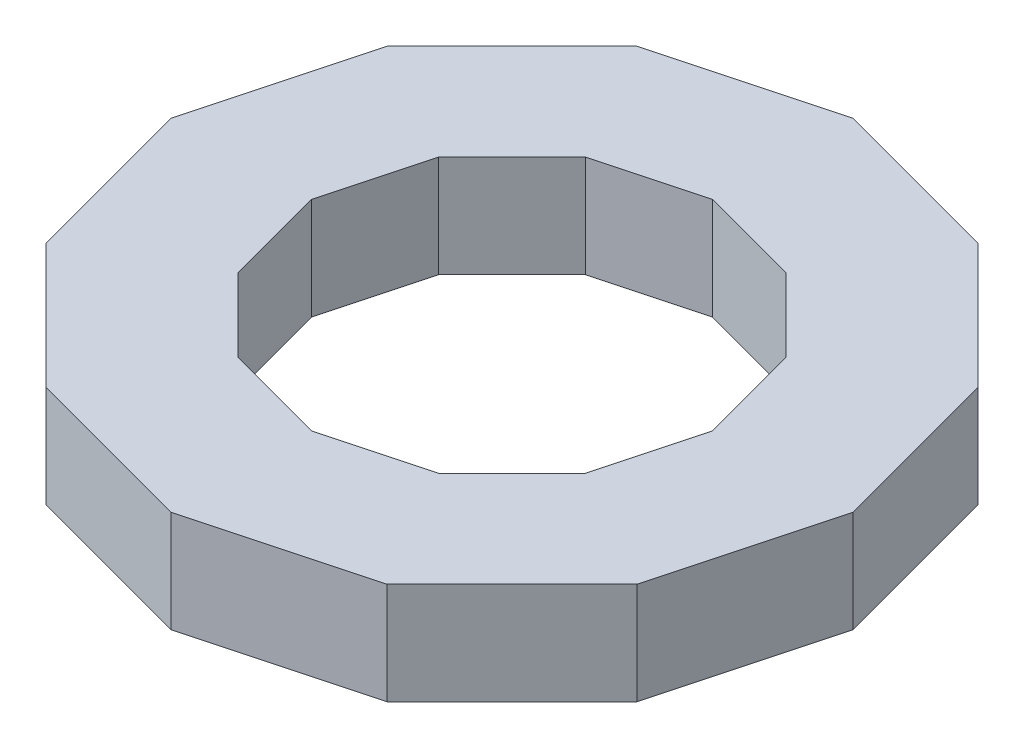
ISO-10303-21;
HEADER;
FILE_DESCRIPTION(('STEP AP214'),'2;1');
FILE_NAME('part.step','',(''),(''),'','','');
FILE_SCHEMA(('AUTOMOTIVE_DESIGN { 1 0 10303 214 1 1 1 1 }'));
ENDSEC;
DATA;
#1=APPLICATION_CONTEXT('core data for automotive mechanical design processes');
#2=APPLICATION_PROTOCOL_DEFINITION('international standard','automotive_design',2000,#1);
#3=PRODUCT_CONTEXT('',#1,'mechanical');
#4=PRODUCT('Part','Part','',(#3));
#5=PRODUCT_RELATED_PRODUCT_CATEGORY('part','',(#4));
#6=PRODUCT_DEFINITION_FORMATION('','',#4);
#7=PRODUCT_DEFINITION_CONTEXT('part definition',#1,'design');
#8=PRODUCT_DEFINITION('design','',#6,#7);
#9=PRODUCT_DEFINITION_SHAPE('','',#8);
#10=(LENGTH_UNIT() NAMED_UNIT(*) SI_UNIT(.MILLI.,.METRE.));
#11=(NAMED_UNIT(*) PLANE_ANGLE_UNIT() SI_UNIT($,.RADIAN.));
#12=(NAMED_UNIT(*) SI_UNIT($,.STERADIAN.) SOLID_ANGLE_UNIT());
#13=UNCERTAINTY_MEASURE_WITH_UNIT(LENGTH_MEASURE(1.E-05),#10,'distance_accuracy_value','');
#14=(GEOMETRIC_REPRESENTATION_CONTEXT(3) GLOBAL_UNCERTAINTY_ASSIGNED_CONTEXT((#13)) GLOBAL_UNIT_ASSIGNED_CONTEXT((#10,
#11,#12)) REPRESENTATION_CONTEXT('',''));
#15=CARTESIAN_POINT('',(0.,0.,0.));
#16=DIRECTION('',(0.,0.,1.));
#17=DIRECTION('',(1.,0.,0.));
#18=AXIS2_PLACEMENT_3D('',#15,#16,#17);
#19=CARTESIAN_POINT('',(0.,19.05,0.));
#20=DIRECTION('',(0.,1.,0.));
#21=DIRECTION('',(0.,0.,1.));
#22=AXIS2_PLACEMENT_3D('',#19,#20,#21);
#23=PLANE('',#22);
#24=DIRECTION('',(0.258819045102522,0.,-0.965925826289068));
#25=VECTOR('',#24,1.);
#26=CARTESIAN_POINT('',(55.2435366988449,19.05,31.8948707840652));
#27=LINE('',#26,#25);
#28=CARTESIAN_POINT('',(55.2435366988449,19.05,31.8948707840652));
#29=VERTEX_POINT('',#28);
#30=CARTESIAN_POINT('',(63.7897415681302,19.05,0.));
#31=VERTEX_POINT('',#30);
#32=EDGE_CURVE('E315',#29,#31,#27,.T.);
#33=ORIENTED_EDGE('',*,*,#32,.T.);
#34=DIRECTION('',(-0.25881904510252,0.,-0.965925826289069));
#35=VECTOR('',#34,1.);
#36=CARTESIAN_POINT('',(63.7897415681302,19.05,0.));
#37=LINE('',#36,#35);
#38=CARTESIAN_POINT('',(55.243536698845,19.05,-31.894870784065));
#39=VERTEX_POINT('',#38);
#40=EDGE_CURVE('E319',#31,#39,#37,.T.);
#41=ORIENTED_EDGE('',*,*,#40,.T.);
#42=DIRECTION('',(-0.707106781186547,0.,-0.707106781186548));
#43=VECTOR('',#42,1.);
#44=CARTESIAN_POINT('',(55.243536698845,19.05,-31.894870784065));
#45=LINE('',#44,#43);
#46=CARTESIAN_POINT('',(31.8948707840651,19.05,-55.243536698845));
#47=VERTEX_POINT('',#46);
#48=EDGE_CURVE('E323',#39,#47,#45,.T.);
#49=ORIENTED_EDGE('',*,*,#48,.T.);
#50=DIRECTION('',(-0.965925826289068,0.,-0.258819045102522));
#51=VECTOR('',#50,1.);
#52=CARTESIAN_POINT('',(31.8948707840651,19.05,-55.243536698845));
#53=LINE('',#52,#51);
#54=CARTESIAN_POINT('',(0.,19.05,-63.7897415681302));
#55=VERTEX_POINT('',#54);
#56=EDGE_CURVE('E325',#47,#55,#53,.T.);
#57=ORIENTED_EDGE('',*,*,#56,.T.);
#58=DIRECTION('',(-0.965925826289069,0.,0.258819045102519));
#59=VECTOR('',#58,1.);
#60=CARTESIAN_POINT('',(0.,19.05,-63.7897415681302));
#61=LINE('',#60,#59);
#62=CARTESIAN_POINT('',(-31.8948707840649,19.05,-55.2435366988451));
#63=VERTEX_POINT('',#62);
#64=EDGE_CURVE('E327',#55,#63,#61,.T.);
#65=ORIENTED_EDGE('',*,*,#64,.T.);
#66=DIRECTION('',(-0.707106781186548,0.,0.707106781186547));
#67=VECTOR('',#66,1.);
#68=CARTESIAN_POINT('',(-31.8948707840649,19.05,-55.2435366988451));
#69=LINE('',#68,#67);
#70=CARTESIAN_POINT('',(-55.2435366988449,19.05,-31.8948707840651));
#71=VERTEX_POINT('',#70);
#72=EDGE_CURVE('E329',#63,#71,#69,.T.);
#73=ORIENTED_EDGE('',*,*,#72,.T.);
#74=DIRECTION('',(-0.258819045102522,0.,0.965925826289068));
#75=VECTOR('',#74,1.);
#76=CARTESIAN_POINT('',(-55.2435366988449,19.05,-31.8948707840651));
#77=LINE('',#76,#75);
#78=CARTESIAN_POINT('',(-63.7897415681302,19.05,0.));
#79=VERTEX_POINT('',#78);
#80=EDGE_CURVE('E331',#71,#79,#77,.T.);
#81=ORIENTED_EDGE('',*,*,#80,.T.);
#82=DIRECTION('',(0.258819045102519,0.,0.965925826289069));
#83=VECTOR('',#82,1.);
#84=CARTESIAN_POINT('',(-63.7897415681302,19.05,0.));
#85=LINE('',#84,#83);
#86=CARTESIAN_POINT('',(-55.2435366988451,19.05,31.894870784065));
#87=VERTEX_POINT('',#86);
#88=EDGE_CURVE('E333',#79,#87,#85,.T.);
#89=ORIENTED_EDGE('',*,*,#88,.T.);
#90=DIRECTION('',(0.707106781186547,0.,0.707106781186548));
#91=VECTOR('',#90,1.);
#92=CARTESIAN_POINT('',(-55.2435366988451,19.05,31.894870784065));
#93=LINE('',#92,#91);
#94=CARTESIAN_POINT('',(-31.8948707840652,19.05,55.2435366988449));
#95=VERTEX_POINT('',#94);
#96=EDGE_CURVE('E336',#87,#95,#93,.T.);
#97=ORIENTED_EDGE('',*,*,#96,.T.);
#98=DIRECTION('',(0.965925826289068,0.,0.258819045102522));
#99=VECTOR('',#98,1.);
#100=CARTESIAN_POINT('',(-31.8948707840652,19.05,55.2435366988449));
#101=LINE('',#100,#99);
#102=CARTESIAN_POINT('',(-1.16998514761717E-13,19.05,63.7897415681302));
#103=VERTEX_POINT('',#102);
#104=EDGE_CURVE('E339',#95,#103,#101,.T.);
#105=ORIENTED_EDGE('',*,*,#104,.T.);
#106=DIRECTION('',(0.965925826289069,0.,-0.258819045102519));
#107=VECTOR('',#106,1.);
#108=CARTESIAN_POINT('',(-1.16998514761717E-13,19.05,63.7897415681302));
#109=LINE('',#108,#107);
#110=CARTESIAN_POINT('',(31.894870784065,19.05,55.243536698845));
#111=VERTEX_POINT('',#110);
#112=EDGE_CURVE('E342',#103,#111,#109,.T.);
#113=ORIENTED_EDGE('',*,*,#112,.T.);
#114=DIRECTION('',(0.707106781186548,0.,-0.707106781186547));
#115=VECTOR('',#114,1.);
#116=CARTESIAN_POINT('',(31.894870784065,19.05,55.243536698845));
#117=LINE('',#116,#115);
#118=EDGE_CURVE('E345',#111,#29,#117,.T.);
#119=ORIENTED_EDGE('',*,*,#118,.T.);
#120=EDGE_LOOP('',(#33,#41,#49,#57,#65,#73,#81,#89,#97,#105,#113,#119));
#121=FACE_BOUND('',#120,.T.);
#122=DIRECTION('',(-0.258819045102519,0.,-0.965925826289069));
#123=VECTOR('',#122,1.);
#124=CARTESIAN_POINT('',(37.4937265857141,19.05,0.));
#125=LINE('',#124,#123);
#126=CARTESIAN_POINT('',(37.4937265857141,19.05,0.));
#127=VERTEX_POINT('',#126);
#128=CARTESIAN_POINT('',(32.4705197057764,19.05,-18.746863292857));
#129=VERTEX_POINT('',#128);
#130=EDGE_CURVE('E205',#127,#129,#125,.T.);
#131=ORIENTED_EDGE('',*,*,#130,.F.);
#132=DIRECTION('',(0.258819045102522,0.,-0.965925826289068));
#133=VECTOR('',#132,1.);
#134=CARTESIAN_POINT('',(32.4705197057763,19.05,18.7468632928571));
#135=LINE('',#134,#133);
#136=CARTESIAN_POINT('',(32.4705197057763,19.05,18.7468632928571));
#137=VERTEX_POINT('',#136);
#138=EDGE_CURVE('E196',#137,#127,#135,.T.);
#139=ORIENTED_EDGE('',*,*,#138,.F.);
#140=DIRECTION('',(0.707106781186548,0.,-0.707106781186547));
#141=VECTOR('',#140,1.);
#142=CARTESIAN_POINT('',(18.746863292857,19.05,32.4705197057764));
#143=LINE('',#142,#141);
#144=CARTESIAN_POINT('',(18.746863292857,19.05,32.4705197057764));
#145=VERTEX_POINT('',#144);
#146=EDGE_CURVE('E248',#145,#137,#143,.T.);
#147=ORIENTED_EDGE('',*,*,#146,.F.);
#148=DIRECTION('',(0.965925826289069,0.,-0.25881904510252));
#149=VECTOR('',#148,1.);
#150=CARTESIAN_POINT('',(0.,19.05,37.4937265857141));
#151=LINE('',#150,#149);
#152=CARTESIAN_POINT('',(0.,19.05,37.4937265857141));
#153=VERTEX_POINT('',#152);
#154=EDGE_CURVE('E245',#153,#145,#151,.T.);
#155=ORIENTED_EDGE('',*,*,#154,.F.);
#156=DIRECTION('',(0.965925826289068,0.,0.258819045102522));
#157=VECTOR('',#156,1.);
#158=CARTESIAN_POINT('',(-18.7468632928571,19.05,32.4705197057764));
#159=LINE('',#158,#157);
#160=CARTESIAN_POINT('',(-18.7468632928571,19.05,32.4705197057764));
#161=VERTEX_POINT('',#160);
#162=EDGE_CURVE('E242',#161,#153,#159,.T.);
#163=ORIENTED_EDGE('',*,*,#162,.F.);
#164=DIRECTION('',(0.707106781186547,0.,0.707106781186548));
#165=VECTOR('',#164,1.);
#166=CARTESIAN_POINT('',(-32.4705197057764,19.05,18.746863292857));
#167=LINE('',#166,#165);
#168=CARTESIAN_POINT('',(-32.4705197057764,19.05,18.746863292857));
#169=VERTEX_POINT('',#168);
#170=EDGE_CURVE('E240',#169,#161,#167,.T.);
#171=ORIENTED_EDGE('',*,*,#170,.F.);
#172=DIRECTION('',(0.258819045102519,0.,0.965925826289069));
#173=VECTOR('',#172,1.);
#174=CARTESIAN_POINT('',(-37.4937265857141,19.05,0.));
#175=LINE('',#174,#173);
#176=CARTESIAN_POINT('',(-37.4937265857141,19.05,0.));
#177=VERTEX_POINT('',#176);
#178=EDGE_CURVE('E238',#177,#169,#175,.T.);
#179=ORIENTED_EDGE('',*,*,#178,.F.);
#180=DIRECTION('',(-0.258819045102522,0.,0.965925826289068));
#181=VECTOR('',#180,1.);
#182=CARTESIAN_POINT('',(-32.4705197057764,19.05,-18.7468632928571));
#183=LINE('',#182,#181);
#184=CARTESIAN_POINT('',(-32.4705197057764,19.05,-18.7468632928571));
#185=VERTEX_POINT('',#184);
#186=EDGE_CURVE('E235',#185,#177,#183,.T.);
#187=ORIENTED_EDGE('',*,*,#186,.F.);
#188=DIRECTION('',(-0.707106781186548,0.,0.707106781186547));
#189=VECTOR('',#188,1.);
#190=CARTESIAN_POINT('',(-18.746863292857,19.05,-32.4705197057765));
#191=LINE('',#190,#189);
#192=CARTESIAN_POINT('',(-18.746863292857,19.05,-32.4705197057765));
#193=VERTEX_POINT('',#192);
#194=EDGE_CURVE('E232',#193,#185,#191,.T.);
#195=ORIENTED_EDGE('',*,*,#194,.F.);
#196=DIRECTION('',(-0.965925826289069,0.,0.258819045102519));
#197=VECTOR('',#196,1.);
#198=CARTESIAN_POINT('',(0.,19.05,-37.4937265857141));
#199=LINE('',#198,#197);
#200=CARTESIAN_POINT('',(0.,19.05,-37.4937265857141));
#201=VERTEX_POINT('',#200);
#202=EDGE_CURVE('E229',#201,#193,#199,.T.);
#203=ORIENTED_EDGE('',*,*,#202,.F.);
#204=DIRECTION('',(-0.965925826289068,0.,-0.258819045102522));
#205=VECTOR('',#204,1.);
#206=CARTESIAN_POINT('',(18.746863292857,19.05,-32.4705197057764));
#207=LINE('',#206,#205);
#208=CARTESIAN_POINT('',(18.746863292857,19.05,-32.4705197057764));
#209=VERTEX_POINT('',#208);
#210=EDGE_CURVE('E224',#209,#201,#207,.T.);
#211=ORIENTED_EDGE('',*,*,#210,.F.);
#212=DIRECTION('',(-0.707106781186547,0.,-0.707106781186548));
#213=VECTOR('',#212,1.);
#214=CARTESIAN_POINT('',(32.4705197057764,19.05,-18.746863292857));
#215=LINE('',#214,#213);
#216=EDGE_CURVE('E218',#129,#209,#215,.T.);
#217=ORIENTED_EDGE('',*,*,#216,.F.);
#218=EDGE_LOOP('',(#131,#139,#147,#155,#163,#171,#179,#187,#195,#203,#211,#217));
#219=FACE_BOUND('',#218,.T.);
#220=ADVANCED_FACE('F35',(#121,#219),#23,.T.);
#221=CARTESIAN_POINT('',(0.,0.,0.));
#222=DIRECTION('',(0.,1.,0.));
#223=DIRECTION('',(0.,0.,1.));
#224=AXIS2_PLACEMENT_3D('',#221,#222,#223);
#225=PLANE('',#224);
#226=DIRECTION('',(0.258819045102522,0.,-0.965925826289068));
#227=VECTOR('',#226,1.);
#228=CARTESIAN_POINT('',(55.2435366988449,0.,31.8948707840652));
#229=LINE('',#228,#227);
#230=CARTESIAN_POINT('',(55.2435366988449,0.,31.8948707840652));
#231=VERTEX_POINT('',#230);
#232=CARTESIAN_POINT('',(63.7897415681302,0.,0.));
#233=VERTEX_POINT('',#232);
#234=EDGE_CURVE('E213',#231,#233,#229,.T.);
#235=ORIENTED_EDGE('',*,*,#234,.F.);
#236=DIRECTION('',(0.707106781186548,0.,-0.707106781186547));
#237=VECTOR('',#236,1.);
#238=CARTESIAN_POINT('',(31.894870784065,0.,55.243536698845));
#239=LINE('',#238,#237);
#240=CARTESIAN_POINT('',(31.894870784065,0.,55.243536698845));
#241=VERTEX_POINT('',#240);
#242=EDGE_CURVE('E320',#241,#231,#239,.T.);
#243=ORIENTED_EDGE('',*,*,#242,.F.);
#244=DIRECTION('',(0.965925826289069,0.,-0.258819045102519));
#245=VECTOR('',#244,1.);
#246=CARTESIAN_POINT('',(-1.16998514761717E-13,0.,63.7897415681302));
#247=LINE('',#246,#245);
#248=CARTESIAN_POINT('',(-1.16998514761717E-13,0.,63.7897415681302));
#249=VERTEX_POINT('',#248);
#250=EDGE_CURVE('E375',#249,#241,#247,.T.);
#251=ORIENTED_EDGE('',*,*,#250,.F.);
#252=DIRECTION('',(0.965925826289068,0.,0.258819045102522));
#253=VECTOR('',#252,1.);
#254=CARTESIAN_POINT('',(-31.8948707840652,0.,55.2435366988449));
#255=LINE('',#254,#253);
#256=CARTESIAN_POINT('',(-31.8948707840652,0.,55.2435366988449));
#257=VERTEX_POINT('',#256);
#258=EDGE_CURVE('E372',#257,#249,#255,.T.);
#259=ORIENTED_EDGE('',*,*,#258,.F.);
#260=DIRECTION('',(0.707106781186547,0.,0.707106781186548));
#261=VECTOR('',#260,1.);
#262=CARTESIAN_POINT('',(-55.2435366988451,0.,31.894870784065));
#263=LINE('',#262,#261);
#264=CARTESIAN_POINT('',(-55.2435366988451,0.,31.894870784065));
#265=VERTEX_POINT('',#264);
#266=EDGE_CURVE('E369',#265,#257,#263,.T.);
#267=ORIENTED_EDGE('',*,*,#266,.F.);
#268=DIRECTION('',(0.258819045102519,0.,0.965925826289069));
#269=VECTOR('',#268,1.);
#270=CARTESIAN_POINT('',(-63.7897415681302,0.,0.));
#271=LINE('',#270,#269);
#272=CARTESIAN_POINT('',(-63.7897415681302,0.,0.));
#273=VERTEX_POINT('',#272);
#274=EDGE_CURVE('E366',#273,#265,#271,.T.);
#275=ORIENTED_EDGE('',*,*,#274,.F.);
#276=DIRECTION('',(-0.258819045102522,0.,0.965925826289068));
#277=VECTOR('',#276,1.);
#278=CARTESIAN_POINT('',(-55.2435366988449,0.,-31.8948707840651));
#279=LINE('',#278,#277);
#280=CARTESIAN_POINT('',(-55.2435366988449,0.,-31.8948707840651));
#281=VERTEX_POINT('',#280);
#282=EDGE_CURVE('E363',#281,#273,#279,.T.);
#283=ORIENTED_EDGE('',*,*,#282,.F.);
#284=DIRECTION('',(-0.707106781186548,0.,0.707106781186547));
#285=VECTOR('',#284,1.);
#286=CARTESIAN_POINT('',(-31.8948707840649,0.,-55.2435366988451));
#287=LINE('',#286,#285);
#288=CARTESIAN_POINT('',(-31.8948707840649,0.,-55.2435366988451));
#289=VERTEX_POINT('',#288);
#290=EDGE_CURVE('E361',#289,#281,#287,.T.);
#291=ORIENTED_EDGE('',*,*,#290,.F.);
#292=DIRECTION('',(-0.965925826289069,0.,0.258819045102519));
#293=VECTOR('',#292,1.);
#294=CARTESIAN_POINT('',(0.,0.,-63.7897415681302));
#295=LINE('',#294,#293);
#296=CARTESIAN_POINT('',(0.,0.,-63.7897415681302));
#297=VERTEX_POINT('',#296);
#298=EDGE_CURVE('E358',#297,#289,#295,.T.);
#299=ORIENTED_EDGE('',*,*,#298,.F.);
#300=DIRECTION('',(-0.965925826289068,0.,-0.258819045102522));
#301=VECTOR('',#300,1.);
#302=CARTESIAN_POINT('',(31.8948707840651,0.,-55.243536698845));
#303=LINE('',#302,#301);
#304=CARTESIAN_POINT('',(31.8948707840651,0.,-55.243536698845));
#305=VERTEX_POINT('',#304);
#306=EDGE_CURVE('E356',#305,#297,#303,.T.);
#307=ORIENTED_EDGE('',*,*,#306,.F.);
#308=DIRECTION('',(-0.707106781186547,0.,-0.707106781186548));
#309=VECTOR('',#308,1.);
#310=CARTESIAN_POINT('',(55.243536698845,0.,-31.894870784065));
#311=LINE('',#310,#309);
#312=CARTESIAN_POINT('',(55.243536698845,0.,-31.894870784065));
#313=VERTEX_POINT('',#312);
#314=EDGE_CURVE('E353',#313,#305,#311,.T.);
#315=ORIENTED_EDGE('',*,*,#314,.F.);
#316=DIRECTION('',(-0.25881904510252,0.,-0.965925826289069));
#317=VECTOR('',#316,1.);
#318=CARTESIAN_POINT('',(63.7897415681302,0.,0.));
#319=LINE('',#318,#317);
#320=EDGE_CURVE('E351',#233,#313,#319,.T.);
#321=ORIENTED_EDGE('',*,*,#320,.F.);
#322=EDGE_LOOP('',(#235,#243,#251,#259,#267,#275,#283,#291,#299,#307,#315,#321));
#323=FACE_BOUND('',#322,.T.);
#324=DIRECTION('',(0.258819045102522,0.,-0.965925826289068));
#325=VECTOR('',#324,1.);
#326=CARTESIAN_POINT('',(32.4705197057763,0.,18.7468632928571));
#327=LINE('',#326,#325);
#328=CARTESIAN_POINT('',(32.4705197057763,0.,18.7468632928571));
#329=VERTEX_POINT('',#328);
#330=CARTESIAN_POINT('',(37.4937265857141,0.,0.));
#331=VERTEX_POINT('',#330);
#332=EDGE_CURVE('E58',#329,#331,#327,.T.);
#333=ORIENTED_EDGE('',*,*,#332,.T.);
#334=DIRECTION('',(-0.258819045102519,0.,-0.965925826289069));
#335=VECTOR('',#334,1.);
#336=CARTESIAN_POINT('',(37.4937265857141,0.,0.));
#337=LINE('',#336,#335);
#338=CARTESIAN_POINT('',(32.4705197057764,0.,-18.746863292857));
#339=VERTEX_POINT('',#338);
#340=EDGE_CURVE('E212',#331,#339,#337,.T.);
#341=ORIENTED_EDGE('',*,*,#340,.T.);
#342=DIRECTION('',(-0.707106781186547,0.,-0.707106781186548));
#343=VECTOR('',#342,1.);
#344=CARTESIAN_POINT('',(32.4705197057764,0.,-18.746863292857));
#345=LINE('',#344,#343);
#346=CARTESIAN_POINT('',(18.746863292857,0.,-32.4705197057764));
#347=VERTEX_POINT('',#346);
#348=EDGE_CURVE('E254',#339,#347,#345,.T.);
#349=ORIENTED_EDGE('',*,*,#348,.T.);
#350=DIRECTION('',(-0.965925826289068,0.,-0.258819045102522));
#351=VECTOR('',#350,1.);
#352=CARTESIAN_POINT('',(18.746863292857,0.,-32.4705197057764));
#353=LINE('',#352,#351);
#354=CARTESIAN_POINT('',(0.,0.,-37.4937265857141));
#355=VERTEX_POINT('',#354);
#356=EDGE_CURVE('E258',#347,#355,#353,.T.);
#357=ORIENTED_EDGE('',*,*,#356,.T.);
#358=DIRECTION('',(-0.965925826289069,0.,0.258819045102519));
#359=VECTOR('',#358,1.);
#360=CARTESIAN_POINT('',(0.,0.,-37.4937265857141));
#361=LINE('',#360,#359);
#362=CARTESIAN_POINT('',(-18.746863292857,0.,-32.4705197057765));
#363=VERTEX_POINT('',#362);
#364=EDGE_CURVE('E262',#355,#363,#361,.T.);
#365=ORIENTED_EDGE('',*,*,#364,.T.);
#366=DIRECTION('',(-0.707106781186548,0.,0.707106781186547));
#367=VECTOR('',#366,1.);
#368=CARTESIAN_POINT('',(-18.746863292857,0.,-32.4705197057765));
#369=LINE('',#368,#367);
#370=CARTESIAN_POINT('',(-32.4705197057764,0.,-18.7468632928571));
#371=VERTEX_POINT('',#370);
#372=EDGE_CURVE('E266',#363,#371,#369,.T.);
#373=ORIENTED_EDGE('',*,*,#372,.T.);
#374=DIRECTION('',(-0.258819045102522,0.,0.965925826289068));
#375=VECTOR('',#374,1.);
#376=CARTESIAN_POINT('',(-32.4705197057764,0.,-18.7468632928571));
#377=LINE('',#376,#375);
#378=CARTESIAN_POINT('',(-37.4937265857141,0.,0.));
#379=VERTEX_POINT('',#378);
#380=EDGE_CURVE('E270',#371,#379,#377,.T.);
#381=ORIENTED_EDGE('',*,*,#380,.T.);
#382=DIRECTION('',(0.258819045102519,0.,0.965925826289069));
#383=VECTOR('',#382,1.);
#384=CARTESIAN_POINT('',(-37.4937265857141,0.,0.));
#385=LINE('',#384,#383);
#386=CARTESIAN_POINT('',(-32.4705197057764,0.,18.746863292857));
#387=VERTEX_POINT('',#386);
#388=EDGE_CURVE('E274',#379,#387,#385,.T.);
#389=ORIENTED_EDGE('',*,*,#388,.T.);
#390=DIRECTION('',(0.707106781186547,0.,0.707106781186548));
#391=VECTOR('',#390,1.);
#392=CARTESIAN_POINT('',(-32.4705197057764,0.,18.746863292857));
#393=LINE('',#392,#391);
#394=CARTESIAN_POINT('',(-18.7468632928571,0.,32.4705197057764));
#395=VERTEX_POINT('',#394);
#396=EDGE_CURVE('E278',#387,#395,#393,.T.);
#397=ORIENTED_EDGE('',*,*,#396,.T.);
#398=DIRECTION('',(0.965925826289068,0.,0.258819045102522));
#399=VECTOR('',#398,1.);
#400=CARTESIAN_POINT('',(-18.7468632928571,0.,32.4705197057764));
#401=LINE('',#400,#399);
#402=CARTESIAN_POINT('',(0.,0.,37.4937265857141));
#403=VERTEX_POINT('',#402);
#404=EDGE_CURVE('E282',#395,#403,#401,.T.);
#405=ORIENTED_EDGE('',*,*,#404,.T.);
#406=DIRECTION('',(0.965925826289069,0.,-0.25881904510252));
#407=VECTOR('',#406,1.);
#408=CARTESIAN_POINT('',(0.,0.,37.4937265857141));
#409=LINE('',#408,#407);
#410=CARTESIAN_POINT('',(18.746863292857,0.,32.4705197057764));
#411=VERTEX_POINT('',#410);
#412=EDGE_CURVE('E286',#403,#411,#409,.T.);
#413=ORIENTED_EDGE('',*,*,#412,.T.);
#414=DIRECTION('',(0.707106781186548,0.,-0.707106781186547));
#415=VECTOR('',#414,1.);
#416=CARTESIAN_POINT('',(18.746863292857,0.,32.4705197057764));
#417=LINE('',#416,#415);
#418=EDGE_CURVE('E206',#411,#329,#417,.T.);
#419=ORIENTED_EDGE('',*,*,#418,.T.);
#420=EDGE_LOOP('',(#333,#341,#349,#357,#365,#373,#381,#389,#397,#405,#413,#419));
#421=FACE_BOUND('',#420,.T.);
#422=ADVANCED_FACE('F422',(#323,#421),#225,.F.);
#423=CARTESIAN_POINT('',(55.2435366988449,19.05,31.8948707840652));
#424=DIRECTION('',(-0.965925826289068,0.,-0.258819045102522));
#425=DIRECTION('',(-0.258819045102522,0.,0.965925826289068));
#426=AXIS2_PLACEMENT_3D('',#423,#424,#425);
#427=PLANE('',#426);
#428=ORIENTED_EDGE('',*,*,#234,.T.);
#429=DIRECTION('',(0.,-1.,0.));
#430=VECTOR('',#429,1.);
#431=CARTESIAN_POINT('',(63.7897415681302,19.05,0.));
#432=LINE('',#431,#430);
#433=EDGE_CURVE('E11',#31,#233,#432,.T.);
#434=ORIENTED_EDGE('',*,*,#433,.F.);
#435=ORIENTED_EDGE('',*,*,#32,.F.);
#436=DIRECTION('',(0.,-1.,0.));
#437=VECTOR('',#436,1.);
#438=CARTESIAN_POINT('',(55.2435366988449,19.05,31.8948707840652));
#439=LINE('',#438,#437);
#440=EDGE_CURVE('E347',#29,#231,#439,.T.);
#441=ORIENTED_EDGE('',*,*,#440,.T.);
#442=EDGE_LOOP('',(#428,#434,#435,#441));
#443=FACE_BOUND('',#442,.T.);
#444=ADVANCED_FACE('F37',(#443),#427,.F.);
#445=CARTESIAN_POINT('',(63.7897415681302,19.05,0.));
#446=DIRECTION('',(-0.965925826289069,0.,0.25881904510252));
#447=DIRECTION('',(0.25881904510252,0.,0.965925826289069));
#448=AXIS2_PLACEMENT_3D('',#445,#446,#447);
#449=PLANE('',#448);
#450=ORIENTED_EDGE('',*,*,#320,.T.);
#451=DIRECTION('',(0.,-1.,0.));
#452=VECTOR('',#451,1.);
#453=CARTESIAN_POINT('',(55.243536698845,19.05,-31.894870784065));
#454=LINE('',#453,#452);
#455=EDGE_CURVE('E43',#39,#313,#454,.T.);
#456=ORIENTED_EDGE('',*,*,#455,.F.);
#457=ORIENTED_EDGE('',*,*,#40,.F.);
#458=ORIENTED_EDGE('',*,*,#433,.T.);
#459=EDGE_LOOP('',(#450,#456,#457,#458));
#460=FACE_BOUND('',#459,.T.);
#461=ADVANCED_FACE('F439',(#460),#449,.F.);
#462=CARTESIAN_POINT('',(55.243536698845,19.05,-31.894870784065));
#463=DIRECTION('',(-0.707106781186548,0.,0.707106781186547));
#464=DIRECTION('',(0.707106781186547,0.,0.707106781186548));
#465=AXIS2_PLACEMENT_3D('',#462,#463,#464);
#466=PLANE('',#465);
#467=ORIENTED_EDGE('',*,*,#314,.T.);
#468=DIRECTION('',(0.,-1.,0.));
#469=VECTOR('',#468,1.);
#470=CARTESIAN_POINT('',(31.8948707840651,19.05,-55.243536698845));
#471=LINE('',#470,#469);
#472=EDGE_CURVE('E409',#47,#305,#471,.T.);
#473=ORIENTED_EDGE('',*,*,#472,.F.);
#474=ORIENTED_EDGE('',*,*,#48,.F.);
#475=ORIENTED_EDGE('',*,*,#455,.T.);
#476=EDGE_LOOP('',(#467,#473,#474,#475));
#477=FACE_BOUND('',#476,.T.);
#478=ADVANCED_FACE('F416',(#477),#466,.F.);
#479=CARTESIAN_POINT('',(31.8948707840651,19.05,-55.243536698845));
#480=DIRECTION('',(-0.258819045102522,0.,0.965925826289068));
#481=DIRECTION('',(0.965925826289068,0.,0.258819045102522));
#482=AXIS2_PLACEMENT_3D('',#479,#480,#481);
#483=PLANE('',#482);
#484=ORIENTED_EDGE('',*,*,#306,.T.);
#485=DIRECTION('',(0.,-1.,0.));
#486=VECTOR('',#485,1.);
#487=CARTESIAN_POINT('',(0.,19.05,-63.7897415681302));
#488=LINE('',#487,#486);
#489=EDGE_CURVE('E406',#55,#297,#488,.T.);
#490=ORIENTED_EDGE('',*,*,#489,.F.);
#491=ORIENTED_EDGE('',*,*,#56,.F.);
#492=ORIENTED_EDGE('',*,*,#472,.T.);
#493=EDGE_LOOP('',(#484,#490,#491,#492));
#494=FACE_BOUND('',#493,.T.);
#495=ADVANCED_FACE('F428',(#494),#483,.F.);
#496=CARTESIAN_POINT('',(0.,19.05,-63.7897415681302));
#497=DIRECTION('',(0.258819045102519,0.,0.965925826289069));
#498=DIRECTION('',(0.965925826289069,0.,-0.258819045102519));
#499=AXIS2_PLACEMENT_3D('',#496,#497,#498);
#500=PLANE('',#499);
#501=ORIENTED_EDGE('',*,*,#298,.T.);
#502=DIRECTION('',(0.,-1.,0.));
#503=VECTOR('',#502,1.);
#504=CARTESIAN_POINT('',(-31.8948707840649,19.05,-55.2435366988451));
#505=LINE('',#504,#503);
#506=EDGE_CURVE('E403',#63,#289,#505,.T.);
#507=ORIENTED_EDGE('',*,*,#506,.F.);
#508=ORIENTED_EDGE('',*,*,#64,.F.);
#509=ORIENTED_EDGE('',*,*,#489,.T.);
#510=EDGE_LOOP('',(#501,#507,#508,#509));
#511=FACE_BOUND('',#510,.T.);
#512=ADVANCED_FACE('F432',(#511),#500,.F.);
#513=CARTESIAN_POINT('',(-31.8948707840649,19.05,-55.2435366988451));
#514=DIRECTION('',(0.707106781186547,0.,0.707106781186548));
#515=DIRECTION('',(0.707106781186548,0.,-0.707106781186547));
#516=AXIS2_PLACEMENT_3D('',#513,#514,#515);
#517=PLANE('',#516);
#518=ORIENTED_EDGE('',*,*,#290,.T.);
#519=DIRECTION('',(0.,-1.,0.));
#520=VECTOR('',#519,1.);
#521=CARTESIAN_POINT('',(-55.2435366988449,19.05,-31.8948707840651));
#522=LINE('',#521,#520);
#523=EDGE_CURVE('E399',#71,#281,#522,.T.);
#524=ORIENTED_EDGE('',*,*,#523,.F.);
#525=ORIENTED_EDGE('',*,*,#72,.F.);
#526=ORIENTED_EDGE('',*,*,#506,.T.);
#527=EDGE_LOOP('',(#518,#524,#525,#526));
#528=FACE_BOUND('',#527,.T.);
#529=ADVANCED_FACE('F472',(#528),#517,.F.);
#530=CARTESIAN_POINT('',(-55.2435366988449,19.05,-31.8948707840651));
#531=DIRECTION('',(0.965925826289068,0.,0.258819045102522));
#532=DIRECTION('',(0.258819045102522,0.,-0.965925826289068));
#533=AXIS2_PLACEMENT_3D('',#530,#531,#532);
#534=PLANE('',#533);
#535=ORIENTED_EDGE('',*,*,#282,.T.);
#536=DIRECTION('',(0.,-1.,0.));
#537=VECTOR('',#536,1.);
#538=CARTESIAN_POINT('',(-63.7897415681302,19.05,0.));
#539=LINE('',#538,#537);
#540=EDGE_CURVE('E396',#79,#273,#539,.T.);
#541=ORIENTED_EDGE('',*,*,#540,.F.);
#542=ORIENTED_EDGE('',*,*,#80,.F.);
#543=ORIENTED_EDGE('',*,*,#523,.T.);
#544=EDGE_LOOP('',(#535,#541,#542,#543));
#545=FACE_BOUND('',#544,.T.);
#546=ADVANCED_FACE('F470',(#545),#534,.F.);
#547=CARTESIAN_POINT('',(-63.7897415681302,19.05,0.));
#548=DIRECTION('',(0.965925826289069,0.,-0.258819045102519));
#549=DIRECTION('',(-0.258819045102519,0.,-0.965925826289069));
#550=AXIS2_PLACEMENT_3D('',#547,#548,#549);
#551=PLANE('',#550);
#552=ORIENTED_EDGE('',*,*,#274,.T.);
#553=DIRECTION('',(0.,-1.,0.));
#554=VECTOR('',#553,1.);
#555=CARTESIAN_POINT('',(-55.2435366988451,19.05,31.894870784065));
#556=LINE('',#555,#554);
#557=EDGE_CURVE('E393',#87,#265,#556,.T.);
#558=ORIENTED_EDGE('',*,*,#557,.F.);
#559=ORIENTED_EDGE('',*,*,#88,.F.);
#560=ORIENTED_EDGE('',*,*,#540,.T.);
#561=EDGE_LOOP('',(#552,#558,#559,#560));
#562=FACE_BOUND('',#561,.T.);
#563=ADVANCED_FACE('F466',(#562),#551,.F.);
#564=CARTESIAN_POINT('',(-55.2435366988451,19.05,31.894870784065));
#565=DIRECTION('',(0.707106781186548,0.,-0.707106781186547));
#566=DIRECTION('',(-0.707106781186547,0.,-0.707106781186548));
#567=AXIS2_PLACEMENT_3D('',#564,#565,#566);
#568=PLANE('',#567);
#569=ORIENTED_EDGE('',*,*,#266,.T.);
#570=DIRECTION('',(0.,-1.,0.));
#571=VECTOR('',#570,1.);
#572=CARTESIAN_POINT('',(-31.8948707840652,19.05,55.2435366988449));
#573=LINE('',#572,#571);
#574=EDGE_CURVE('E389',#95,#257,#573,.T.);
#575=ORIENTED_EDGE('',*,*,#574,.F.);
#576=ORIENTED_EDGE('',*,*,#96,.F.);
#577=ORIENTED_EDGE('',*,*,#557,.T.);
#578=EDGE_LOOP('',(#569,#575,#576,#577));
#579=FACE_BOUND('',#578,.T.);
#580=ADVANCED_FACE('F461',(#579),#568,.F.);
#581=CARTESIAN_POINT('',(-31.8948707840652,19.05,55.2435366988449));
#582=DIRECTION('',(0.258819045102522,0.,-0.965925826289068));
#583=DIRECTION('',(-0.965925826289068,0.,-0.258819045102522));
#584=AXIS2_PLACEMENT_3D('',#581,#582,#583);
#585=PLANE('',#584);
#586=ORIENTED_EDGE('',*,*,#258,.T.);
#587=DIRECTION('',(0.,-1.,0.));
#588=VECTOR('',#587,1.);
#589=CARTESIAN_POINT('',(-1.16998514761717E-13,19.05,63.7897415681302));
#590=LINE('',#589,#588);
#591=EDGE_CURVE('E385',#103,#249,#590,.T.);
#592=ORIENTED_EDGE('',*,*,#591,.F.);
#593=ORIENTED_EDGE('',*,*,#104,.F.);
#594=ORIENTED_EDGE('',*,*,#574,.T.);
#595=EDGE_LOOP('',(#586,#592,#593,#594));
#596=FACE_BOUND('',#595,.T.);
#597=ADVANCED_FACE('F455',(#596),#585,.F.);
#598=CARTESIAN_POINT('',(-1.16998514761717E-13,19.05,63.7897415681302));
#599=DIRECTION('',(-0.258819045102519,0.,-0.965925826289069));
#600=DIRECTION('',(-0.965925826289069,0.,0.258819045102519));
#601=AXIS2_PLACEMENT_3D('',#598,#599,#600);
#602=PLANE('',#601);
#603=ORIENTED_EDGE('',*,*,#250,.T.);
#604=DIRECTION('',(0.,-1.,0.));
#605=VECTOR('',#604,1.);
#606=CARTESIAN_POINT('',(31.894870784065,19.05,55.243536698845));
#607=LINE('',#606,#605);
#608=EDGE_CURVE('E381',#111,#241,#607,.T.);
#609=ORIENTED_EDGE('',*,*,#608,.F.);
#610=ORIENTED_EDGE('',*,*,#112,.F.);
#611=ORIENTED_EDGE('',*,*,#591,.T.);
#612=EDGE_LOOP('',(#603,#609,#610,#611));
#613=FACE_BOUND('',#612,.T.);
#614=ADVANCED_FACE('F451',(#613),#602,.F.);
#615=CARTESIAN_POINT('',(31.894870784065,19.05,55.243536698845));
#616=DIRECTION('',(-0.707106781186547,0.,-0.707106781186548));
#617=DIRECTION('',(-0.707106781186548,0.,0.707106781186547));
#618=AXIS2_PLACEMENT_3D('',#615,#616,#617);
#619=PLANE('',#618);
#620=ORIENTED_EDGE('',*,*,#242,.T.);
#621=ORIENTED_EDGE('',*,*,#440,.F.);
#622=ORIENTED_EDGE('',*,*,#118,.F.);
#623=ORIENTED_EDGE('',*,*,#608,.T.);
#624=EDGE_LOOP('',(#620,#621,#622,#623));
#625=FACE_BOUND('',#624,.T.);
#626=ADVANCED_FACE('F446',(#625),#619,.F.);
#627=CARTESIAN_POINT('',(32.4705197057763,19.05,18.7468632928571));
#628=DIRECTION('',(-0.965925826289068,0.,-0.258819045102522));
#629=DIRECTION('',(-0.258819045102522,0.,0.965925826289068));
#630=AXIS2_PLACEMENT_3D('',#627,#628,#629);
#631=PLANE('',#630);
#632=ORIENTED_EDGE('',*,*,#332,.F.);
#633=DIRECTION('',(0.,-1.,0.));
#634=VECTOR('',#633,1.);
#635=CARTESIAN_POINT('',(32.4705197057763,19.05,18.7468632928571));
#636=LINE('',#635,#634);
#637=EDGE_CURVE('E200',#137,#329,#636,.T.);
#638=ORIENTED_EDGE('',*,*,#637,.F.);
#639=ORIENTED_EDGE('',*,*,#138,.T.);
#640=DIRECTION('',(0.,-1.,0.));
#641=VECTOR('',#640,1.);
#642=CARTESIAN_POINT('',(37.4937265857141,19.05,0.));
#643=LINE('',#642,#641);
#644=EDGE_CURVE('E199',#127,#331,#643,.T.);
#645=ORIENTED_EDGE('',*,*,#644,.T.);
#646=EDGE_LOOP('',(#632,#638,#639,#645));
#647=FACE_BOUND('',#646,.T.);
#648=ADVANCED_FACE('F198',(#647),#631,.T.);
#649=CARTESIAN_POINT('',(37.4937265857141,19.05,0.));
#650=DIRECTION('',(-0.965925826289069,0.,0.258819045102519));
#651=DIRECTION('',(0.258819045102519,0.,0.965925826289069));
#652=AXIS2_PLACEMENT_3D('',#649,#650,#651);
#653=PLANE('',#652);
#654=ORIENTED_EDGE('',*,*,#340,.F.);
#655=ORIENTED_EDGE('',*,*,#644,.F.);
#656=ORIENTED_EDGE('',*,*,#130,.T.);
#657=DIRECTION('',(0.,-1.,0.));
#658=VECTOR('',#657,1.);
#659=CARTESIAN_POINT('',(32.4705197057764,19.05,-18.746863292857));
#660=LINE('',#659,#658);
#661=EDGE_CURVE('E214',#129,#339,#660,.T.);
#662=ORIENTED_EDGE('',*,*,#661,.T.);
#663=EDGE_LOOP('',(#654,#655,#656,#662));
#664=FACE_BOUND('',#663,.T.);
#665=ADVANCED_FACE('F209',(#664),#653,.T.);
#666=CARTESIAN_POINT('',(32.4705197057764,19.05,-18.746863292857));
#667=DIRECTION('',(-0.707106781186548,0.,0.707106781186547));
#668=DIRECTION('',(0.707106781186547,0.,0.707106781186548));
#669=AXIS2_PLACEMENT_3D('',#666,#667,#668);
#670=PLANE('',#669);
#671=ORIENTED_EDGE('',*,*,#348,.F.);
#672=ORIENTED_EDGE('',*,*,#661,.F.);
#673=ORIENTED_EDGE('',*,*,#216,.T.);
#674=DIRECTION('',(0.,-1.,0.));
#675=VECTOR('',#674,1.);
#676=CARTESIAN_POINT('',(18.746863292857,19.05,-32.4705197057764));
#677=LINE('',#676,#675);
#678=EDGE_CURVE('E312',#209,#347,#677,.T.);
#679=ORIENTED_EDGE('',*,*,#678,.T.);
#680=EDGE_LOOP('',(#671,#672,#673,#679));
#681=FACE_BOUND('',#680,.T.);
#682=ADVANCED_FACE('F530',(#681),#670,.T.);
#683=CARTESIAN_POINT('',(18.746863292857,19.05,-32.4705197057764));
#684=DIRECTION('',(-0.258819045102522,0.,0.965925826289068));
#685=DIRECTION('',(0.965925826289068,0.,0.258819045102522));
#686=AXIS2_PLACEMENT_3D('',#683,#684,#685);
#687=PLANE('',#686);
#688=ORIENTED_EDGE('',*,*,#356,.F.);
#689=ORIENTED_EDGE('',*,*,#678,.F.);
#690=ORIENTED_EDGE('',*,*,#210,.T.);
#691=DIRECTION('',(0.,-1.,0.));
#692=VECTOR('',#691,1.);
#693=CARTESIAN_POINT('',(0.,19.05,-37.4937265857141));
#694=LINE('',#693,#692);
#695=EDGE_CURVE('E310',#201,#355,#694,.T.);
#696=ORIENTED_EDGE('',*,*,#695,.T.);
#697=EDGE_LOOP('',(#688,#689,#690,#696));
#698=FACE_BOUND('',#697,.T.);
#699=ADVANCED_FACE('F536',(#698),#687,.T.);
#700=CARTESIAN_POINT('',(0.,19.05,-37.4937265857141));
#701=DIRECTION('',(0.258819045102519,0.,0.965925826289069));
#702=DIRECTION('',(0.965925826289069,0.,-0.258819045102519));
#703=AXIS2_PLACEMENT_3D('',#700,#701,#702);
#704=PLANE('',#703);
#705=ORIENTED_EDGE('',*,*,#364,.F.);
#706=ORIENTED_EDGE('',*,*,#695,.F.);
#707=ORIENTED_EDGE('',*,*,#202,.T.);
#708=DIRECTION('',(0.,-1.,0.));
#709=VECTOR('',#708,1.);
#710=CARTESIAN_POINT('',(-18.746863292857,19.05,-32.4705197057765));
#711=LINE('',#710,#709);
#712=EDGE_CURVE('E308',#193,#363,#711,.T.);
#713=ORIENTED_EDGE('',*,*,#712,.T.);
#714=EDGE_LOOP('',(#705,#706,#707,#713));
#715=FACE_BOUND('',#714,.T.);
#716=ADVANCED_FACE('F544',(#715),#704,.T.);
#717=CARTESIAN_POINT('',(-18.746863292857,19.05,-32.4705197057765));
#718=DIRECTION('',(0.707106781186547,0.,0.707106781186548));
#719=DIRECTION('',(0.707106781186548,0.,-0.707106781186547));
#720=AXIS2_PLACEMENT_3D('',#717,#718,#719);
#721=PLANE('',#720);
#722=ORIENTED_EDGE('',*,*,#372,.F.);
#723=ORIENTED_EDGE('',*,*,#712,.F.);
#724=ORIENTED_EDGE('',*,*,#194,.T.);
#725=DIRECTION('',(0.,-1.,0.));
#726=VECTOR('',#725,1.);
#727=CARTESIAN_POINT('',(-32.4705197057764,19.05,-18.7468632928571));
#728=LINE('',#727,#726);
#729=EDGE_CURVE('E306',#185,#371,#728,.T.);
#730=ORIENTED_EDGE('',*,*,#729,.T.);
#731=EDGE_LOOP('',(#722,#723,#724,#730));
#732=FACE_BOUND('',#731,.T.);
#733=ADVANCED_FACE('F552',(#732),#721,.T.);
#734=CARTESIAN_POINT('',(-32.4705197057764,19.05,-18.7468632928571));
#735=DIRECTION('',(0.965925826289068,0.,0.258819045102522));
#736=DIRECTION('',(0.258819045102522,0.,-0.965925826289068));
#737=AXIS2_PLACEMENT_3D('',#734,#735,#736);
#738=PLANE('',#737);
#739=ORIENTED_EDGE('',*,*,#380,.F.);
#740=ORIENTED_EDGE('',*,*,#729,.F.);
#741=ORIENTED_EDGE('',*,*,#186,.T.);
#742=DIRECTION('',(0.,-1.,0.));
#743=VECTOR('',#742,1.);
#744=CARTESIAN_POINT('',(-37.4937265857141,19.05,0.));
#745=LINE('',#744,#743);
#746=EDGE_CURVE('E304',#177,#379,#745,.T.);
#747=ORIENTED_EDGE('',*,*,#746,.T.);
#748=EDGE_LOOP('',(#739,#740,#741,#747));
#749=FACE_BOUND('',#748,.T.);
#750=ADVANCED_FACE('F559',(#749),#738,.T.);
#751=CARTESIAN_POINT('',(-37.4937265857141,19.05,0.));
#752=DIRECTION('',(0.965925826289069,0.,-0.258819045102519));
#753=DIRECTION('',(-0.258819045102519,0.,-0.965925826289069));
#754=AXIS2_PLACEMENT_3D('',#751,#752,#753);
#755=PLANE('',#754);
#756=ORIENTED_EDGE('',*,*,#388,.F.);
#757=ORIENTED_EDGE('',*,*,#746,.F.);
#758=ORIENTED_EDGE('',*,*,#178,.T.);
#759=DIRECTION('',(0.,-1.,0.));
#760=VECTOR('',#759,1.);
#761=CARTESIAN_POINT('',(-32.4705197057764,19.05,18.746863292857));
#762=LINE('',#761,#760);
#763=EDGE_CURVE('E302',#169,#387,#762,.T.);
#764=ORIENTED_EDGE('',*,*,#763,.T.);
#765=EDGE_LOOP('',(#756,#757,#758,#764));
#766=FACE_BOUND('',#765,.T.);
#767=ADVANCED_FACE('F567',(#766),#755,.T.);
#768=CARTESIAN_POINT('',(-32.4705197057764,19.05,18.746863292857));
#769=DIRECTION('',(0.707106781186548,0.,-0.707106781186547));
#770=DIRECTION('',(-0.707106781186547,0.,-0.707106781186548));
#771=AXIS2_PLACEMENT_3D('',#768,#769,#770);
#772=PLANE('',#771);
#773=ORIENTED_EDGE('',*,*,#396,.F.);
#774=ORIENTED_EDGE('',*,*,#763,.F.);
#775=ORIENTED_EDGE('',*,*,#170,.T.);
#776=DIRECTION('',(0.,-1.,0.));
#777=VECTOR('',#776,1.);
#778=CARTESIAN_POINT('',(-18.7468632928571,19.05,32.4705197057764));
#779=LINE('',#778,#777);
#780=EDGE_CURVE('E299',#161,#395,#779,.T.);
#781=ORIENTED_EDGE('',*,*,#780,.T.);
#782=EDGE_LOOP('',(#773,#774,#775,#781));
#783=FACE_BOUND('',#782,.T.);
#784=ADVANCED_FACE('F576',(#783),#772,.T.);
#785=CARTESIAN_POINT('',(-18.7468632928571,19.05,32.4705197057764));
#786=DIRECTION('',(0.258819045102522,0.,-0.965925826289068));
#787=DIRECTION('',(-0.965925826289068,0.,-0.258819045102522));
#788=AXIS2_PLACEMENT_3D('',#785,#786,#787);
#789=PLANE('',#788);
#790=ORIENTED_EDGE('',*,*,#404,.F.);
#791=ORIENTED_EDGE('',*,*,#780,.F.);
#792=ORIENTED_EDGE('',*,*,#162,.T.);
#793=DIRECTION('',(0.,-1.,0.));
#794=VECTOR('',#793,1.);
#795=CARTESIAN_POINT('',(0.,19.05,37.4937265857141));
#796=LINE('',#795,#794);
#797=EDGE_CURVE('E296',#153,#403,#796,.T.);
#798=ORIENTED_EDGE('',*,*,#797,.T.);
#799=EDGE_LOOP('',(#790,#791,#792,#798));
#800=FACE_BOUND('',#799,.T.);
#801=ADVANCED_FACE('F583',(#800),#789,.T.);
#802=CARTESIAN_POINT('',(0.,19.05,37.4937265857141));
#803=DIRECTION('',(-0.25881904510252,0.,-0.965925826289069));
#804=DIRECTION('',(-0.965925826289069,0.,0.25881904510252));
#805=AXIS2_PLACEMENT_3D('',#802,#803,#804);
#806=PLANE('',#805);
#807=ORIENTED_EDGE('',*,*,#412,.F.);
#808=ORIENTED_EDGE('',*,*,#797,.F.);
#809=ORIENTED_EDGE('',*,*,#154,.T.);
#810=DIRECTION('',(0.,-1.,0.));
#811=VECTOR('',#810,1.);
#812=CARTESIAN_POINT('',(18.746863292857,19.05,32.4705197057764));
#813=LINE('',#812,#811);
#814=EDGE_CURVE('E50',#145,#411,#813,.T.);
#815=ORIENTED_EDGE('',*,*,#814,.T.);
#816=EDGE_LOOP('',(#807,#808,#809,#815));
#817=FACE_BOUND('',#816,.T.);
#818=ADVANCED_FACE('F591',(#817),#806,.T.);
#819=CARTESIAN_POINT('',(18.746863292857,19.05,32.4705197057764));
#820=DIRECTION('',(-0.707106781186547,0.,-0.707106781186548));
#821=DIRECTION('',(-0.707106781186548,0.,0.707106781186547));
#822=AXIS2_PLACEMENT_3D('',#819,#820,#821);
#823=PLANE('',#822);
#824=ORIENTED_EDGE('',*,*,#418,.F.);
#825=ORIENTED_EDGE('',*,*,#814,.F.);
#826=ORIENTED_EDGE('',*,*,#146,.T.);
#827=ORIENTED_EDGE('',*,*,#637,.T.);
#828=EDGE_LOOP('',(#824,#825,#826,#827));
#829=FACE_BOUND('',#828,.T.);
#830=ADVANCED_FACE('F599',(#829),#823,.T.);
#831=CLOSED_SHELL('',(#220,#422,#444,#461,#478,#495,#512,#529,#546,#563,#580,#597,#614,#626,
#648,#665,#682,#699,#716,#733,#750,#767,#784,#801,#818,#830));
#832=MANIFOLD_SOLID_BREP('B2',#831);
#833=ADVANCED_BREP_SHAPE_REPRESENTATION('',(#18,#832),#14);
#834=SHAPE_DEFINITION_REPRESENTATION(#9,#833);
ENDSEC;
END-ISO-10303-21;
